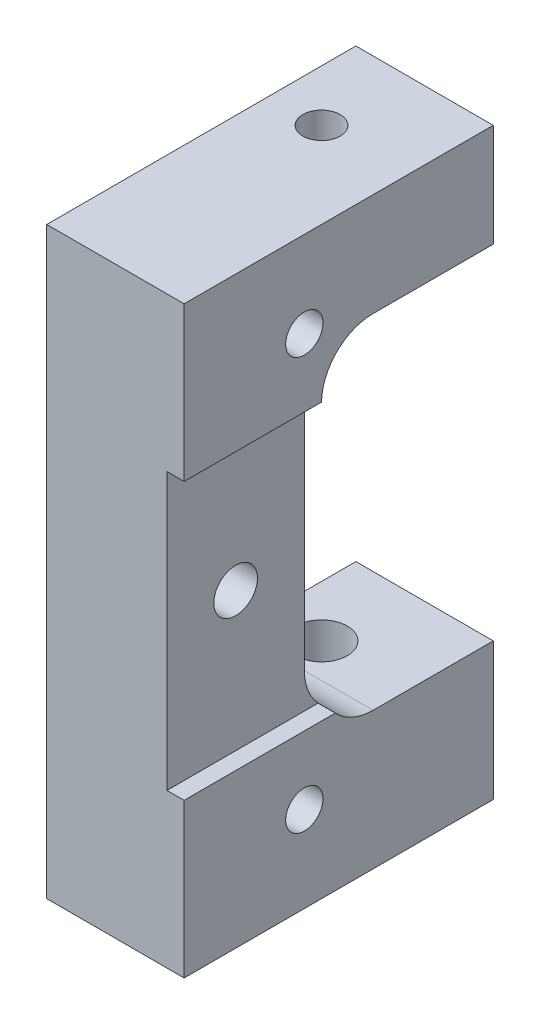
ISO-10303-21;
HEADER;
FILE_DESCRIPTION(('STEP AP214'),'2;1');
FILE_NAME('part.step','',(''),(''),'','','');
FILE_SCHEMA(('AUTOMOTIVE_DESIGN { 1 0 10303 214 1 1 1 1 }'));
ENDSEC;
DATA;
#1=APPLICATION_CONTEXT('core data for automotive mechanical design processes');
#2=APPLICATION_PROTOCOL_DEFINITION('international standard','automotive_design',2000,#1);
#3=PRODUCT_CONTEXT('',#1,'mechanical');
#4=PRODUCT('Part','Part','',(#3));
#5=PRODUCT_RELATED_PRODUCT_CATEGORY('part','',(#4));
#6=PRODUCT_DEFINITION_FORMATION('','',#4);
#7=PRODUCT_DEFINITION_CONTEXT('part definition',#1,'design');
#8=PRODUCT_DEFINITION('design','',#6,#7);
#9=PRODUCT_DEFINITION_SHAPE('','',#8);
#10=(LENGTH_UNIT() NAMED_UNIT(*) SI_UNIT(.MILLI.,.METRE.));
#11=(NAMED_UNIT(*) PLANE_ANGLE_UNIT() SI_UNIT($,.RADIAN.));
#12=(NAMED_UNIT(*) SI_UNIT($,.STERADIAN.) SOLID_ANGLE_UNIT());
#13=UNCERTAINTY_MEASURE_WITH_UNIT(LENGTH_MEASURE(1.E-05),#10,'distance_accuracy_value','');
#14=(GEOMETRIC_REPRESENTATION_CONTEXT(3) GLOBAL_UNCERTAINTY_ASSIGNED_CONTEXT((#13)) GLOBAL_UNIT_ASSIGNED_CONTEXT((#10,
#11,#12)) REPRESENTATION_CONTEXT('',''));
#15=CARTESIAN_POINT('',(0.,0.,0.));
#16=DIRECTION('',(0.,0.,1.));
#17=DIRECTION('',(1.,0.,0.));
#18=AXIS2_PLACEMENT_3D('',#15,#16,#17);
#19=CARTESIAN_POINT('',(-6.35,-46.0375,3.175));
#20=DIRECTION('',(1.,0.,0.));
#21=DIRECTION('',(0.,0.,-1.));
#22=AXIS2_PLACEMENT_3D('',#19,#20,#21);
#23=CYLINDRICAL_SURFACE('',#22,1.7272);
#24=CARTESIAN_POINT('',(6.35,-46.0375,3.175));
#25=DIRECTION('',(1.,0.,0.));
#26=DIRECTION('',(0.,0.,-1.));
#27=AXIS2_PLACEMENT_3D('',#24,#25,#26);
#28=CIRCLE('',#27,1.7272);
#29=CARTESIAN_POINT('',(6.35,-46.0375,1.4478));
#30=VERTEX_POINT('',#29);
#31=EDGE_CURVE('E129',#30,#30,#28,.F.);
#32=ORIENTED_EDGE('',*,*,#31,.F.);
#33=EDGE_LOOP('',(#32));
#34=FACE_BOUND('',#33,.T.);
#35=CARTESIAN_POINT('',(-5.08,-46.0375,3.175));
#36=DIRECTION('',(-1.,0.,0.));
#37=DIRECTION('',(0.,0.,1.));
#38=AXIS2_PLACEMENT_3D('',#35,#36,#37);
#39=CIRCLE('',#38,1.7272);
#40=CARTESIAN_POINT('',(-5.08,-46.0375,4.9022));
#41=VERTEX_POINT('',#40);
#42=EDGE_CURVE('E21',#41,#41,#39,.T.);
#43=ORIENTED_EDGE('',*,*,#42,.T.);
#44=EDGE_LOOP('',(#43));
#45=FACE_BOUND('',#44,.T.);
#46=ADVANCED_FACE('F17',(#34,#45),#23,.F.);
#47=CARTESIAN_POINT('',(-6.35,-7.9375,3.175));
#48=DIRECTION('',(1.,0.,0.));
#49=DIRECTION('',(0.,0.,-1.));
#50=AXIS2_PLACEMENT_3D('',#47,#48,#49);
#51=CYLINDRICAL_SURFACE('',#50,1.7272);
#52=CARTESIAN_POINT('',(6.35,-7.9375,3.175));
#53=DIRECTION('',(1.,0.,0.));
#54=DIRECTION('',(0.,0.,-1.));
#55=AXIS2_PLACEMENT_3D('',#52,#53,#54);
#56=CIRCLE('',#55,1.7272);
#57=CARTESIAN_POINT('',(6.35,-7.9375,1.4478));
#58=VERTEX_POINT('',#57);
#59=EDGE_CURVE('E239',#58,#58,#56,.F.);
#60=ORIENTED_EDGE('',*,*,#59,.F.);
#61=EDGE_LOOP('',(#60));
#62=FACE_BOUND('',#61,.T.);
#63=CARTESIAN_POINT('',(-5.08,-7.9375,3.175));
#64=DIRECTION('',(-1.,0.,0.));
#65=DIRECTION('',(0.,0.,1.));
#66=AXIS2_PLACEMENT_3D('',#63,#64,#65);
#67=CIRCLE('',#66,1.7272);
#68=CARTESIAN_POINT('',(-5.08,-7.9375,4.9022));
#69=VERTEX_POINT('',#68);
#70=EDGE_CURVE('E189',#69,#69,#67,.T.);
#71=ORIENTED_EDGE('',*,*,#70,.T.);
#72=EDGE_LOOP('',(#71));
#73=FACE_BOUND('',#72,.T.);
#74=ADVANCED_FACE('F312',(#62,#73),#51,.F.);
#75=CARTESIAN_POINT('',(0.,-53.975,-14.2875));
#76=DIRECTION('',(0.,0.,-1.));
#77=DIRECTION('',(-1.,0.,0.));
#78=AXIS2_PLACEMENT_3D('',#75,#76,#77);
#79=PLANE('',#78);
#80=DIRECTION('',(0.,1.,0.));
#81=VECTOR('',#80,1.);
#82=CARTESIAN_POINT('',(6.35,-53.975,-14.2875));
#83=LINE('',#82,#81);
#84=CARTESIAN_POINT('',(6.35,-9.5188278,-14.2875));
#85=VERTEX_POINT('',#84);
#86=CARTESIAN_POINT('',(6.35,0.,-14.2875));
#87=VERTEX_POINT('',#86);
#88=EDGE_CURVE('E266',#85,#87,#83,.T.);
#89=ORIENTED_EDGE('',*,*,#88,.F.);
#90=DIRECTION('',(-1.,0.,0.));
#91=VECTOR('',#90,1.);
#92=CARTESIAN_POINT('',(56.0388525864335,-9.5188278,-14.2875));
#93=LINE('',#92,#91);
#94=CARTESIAN_POINT('',(-6.35,-9.5188278,-14.2875));
#95=VERTEX_POINT('',#94);
#96=EDGE_CURVE('E130',#85,#95,#93,.T.);
#97=ORIENTED_EDGE('',*,*,#96,.T.);
#98=DIRECTION('',(0.,1.,0.));
#99=VECTOR('',#98,1.);
#100=CARTESIAN_POINT('',(-6.35,-53.975,-14.2875));
#101=LINE('',#100,#99);
#102=CARTESIAN_POINT('',(-6.35,0.,-14.2875));
#103=VERTEX_POINT('',#102);
#104=EDGE_CURVE('E147',#95,#103,#101,.T.);
#105=ORIENTED_EDGE('',*,*,#104,.T.);
#106=DIRECTION('',(-1.,0.,0.));
#107=VECTOR('',#106,1.);
#108=CARTESIAN_POINT('',(0.,0.,-14.2875));
#109=LINE('',#108,#107);
#110=EDGE_CURVE('E261',#87,#103,#109,.T.);
#111=ORIENTED_EDGE('',*,*,#110,.F.);
#112=EDGE_LOOP('',(#89,#97,#105,#111));
#113=FACE_BOUND('',#112,.T.);
#114=ADVANCED_FACE('F282',(#113),#79,.T.);
#115=CARTESIAN_POINT('',(6.35,-53.975,0.));
#116=DIRECTION('',(1.,0.,0.));
#117=DIRECTION('',(0.,0.,-1.));
#118=AXIS2_PLACEMENT_3D('',#115,#116,#117);
#119=PLANE('',#118);
#120=ORIENTED_EDGE('',*,*,#59,.T.);
#121=EDGE_LOOP('',(#120));
#122=FACE_BOUND('',#121,.T.);
#123=DIRECTION('',(0.,0.,-1.));
#124=VECTOR('',#123,1.);
#125=CARTESIAN_POINT('',(6.35,-14.224,0.));
#126=LINE('',#125,#124);
#127=CARTESIAN_POINT('',(6.35,-14.224,14.2875));
#128=VERTEX_POINT('',#127);
#129=CARTESIAN_POINT('',(6.35,-14.224,1.58715495058143));
#130=VERTEX_POINT('',#129);
#131=EDGE_CURVE('E33',#128,#130,#126,.T.);
#132=ORIENTED_EDGE('',*,*,#131,.T.);
#133=CARTESIAN_POINT('',(6.35,-14.2813278,-3.175));
#134=DIRECTION('',(1.,0.,0.));
#135=DIRECTION('',(0.,0.,-1.));
#136=AXIS2_PLACEMENT_3D('',#133,#134,#135);
#137=CIRCLE('',#136,4.7625);
#138=CARTESIAN_POINT('',(6.35,-9.5188278,-3.175));
#139=VERTEX_POINT('',#138);
#140=EDGE_CURVE('E11',#130,#139,#137,.F.);
#141=ORIENTED_EDGE('',*,*,#140,.T.);
#142=DIRECTION('',(0.,0.,1.));
#143=VECTOR('',#142,1.);
#144=CARTESIAN_POINT('',(6.35,-9.5188278,0.));
#145=LINE('',#144,#143);
#146=EDGE_CURVE('E163',#85,#139,#145,.T.);
#147=ORIENTED_EDGE('',*,*,#146,.F.);
#148=ORIENTED_EDGE('',*,*,#88,.T.);
#149=DIRECTION('',(0.,0.,-1.));
#150=VECTOR('',#149,1.);
#151=CARTESIAN_POINT('',(6.35,0.,0.));
#152=LINE('',#151,#150);
#153=CARTESIAN_POINT('',(6.35,0.,14.2875));
#154=VERTEX_POINT('',#153);
#155=EDGE_CURVE('E256',#154,#87,#152,.T.);
#156=ORIENTED_EDGE('',*,*,#155,.F.);
#157=DIRECTION('',(0.,1.,0.));
#158=VECTOR('',#157,1.);
#159=CARTESIAN_POINT('',(6.35,-53.975,14.2875));
#160=LINE('',#159,#158);
#161=EDGE_CURVE('E150',#128,#154,#160,.T.);
#162=ORIENTED_EDGE('',*,*,#161,.F.);
#163=EDGE_LOOP('',(#132,#141,#147,#148,#156,#162));
#164=FACE_BOUND('',#163,.T.);
#165=ADVANCED_FACE('F290',(#122,#164),#119,.T.);
#166=CARTESIAN_POINT('',(-6.35,-53.975,0.));
#167=DIRECTION('',(1.,0.,0.));
#168=DIRECTION('',(0.,0.,-1.));
#169=AXIS2_PLACEMENT_3D('',#166,#167,#168);
#170=PLANE('',#169);
#171=CARTESIAN_POINT('',(-6.35,-7.9375,3.175));
#172=DIRECTION('',(-1.,0.,0.));
#173=DIRECTION('',(0.,0.,1.));
#174=AXIS2_PLACEMENT_3D('',#171,#172,#173);
#175=CIRCLE('',#174,3.96875);
#176=CARTESIAN_POINT('',(-6.35,-7.9375,7.14375));
#177=VERTEX_POINT('',#176);
#178=EDGE_CURVE('E197',#177,#177,#175,.T.);
#179=ORIENTED_EDGE('',*,*,#178,.F.);
#180=EDGE_LOOP('',(#179));
#181=FACE_BOUND('',#180,.T.);
#182=CARTESIAN_POINT('',(-6.35,-46.0375,3.175));
#183=DIRECTION('',(-1.,0.,0.));
#184=DIRECTION('',(0.,0.,1.));
#185=AXIS2_PLACEMENT_3D('',#182,#183,#184);
#186=CIRCLE('',#185,3.96875);
#187=CARTESIAN_POINT('',(-6.35,-46.0375,7.14375));
#188=VERTEX_POINT('',#187);
#189=EDGE_CURVE('E207',#188,#188,#186,.T.);
#190=ORIENTED_EDGE('',*,*,#189,.F.);
#191=EDGE_LOOP('',(#190));
#192=FACE_BOUND('',#191,.T.);
#193=CARTESIAN_POINT('',(-6.35,-26.924,7.9375));
#194=DIRECTION('',(1.,0.,0.));
#195=DIRECTION('',(0.,0.,-1.));
#196=AXIS2_PLACEMENT_3D('',#193,#194,#195);
#197=CIRCLE('',#196,4.7625);
#198=CARTESIAN_POINT('',(-6.35,-26.924,3.175));
#199=VERTEX_POINT('',#198);
#200=EDGE_CURVE('E218',#199,#199,#197,.T.);
#201=ORIENTED_EDGE('',*,*,#200,.T.);
#202=EDGE_LOOP('',(#201));
#203=FACE_BOUND('',#202,.T.);
#204=DIRECTION('',(0.,0.,1.));
#205=VECTOR('',#204,1.);
#206=CARTESIAN_POINT('',(-6.35,-41.275,-6.35));
#207=LINE('',#206,#205);
#208=CARTESIAN_POINT('',(-6.35,-41.275,-14.2875));
#209=VERTEX_POINT('',#208);
#210=CARTESIAN_POINT('',(-6.35,-41.275,-3.175));
#211=VERTEX_POINT('',#210);
#212=EDGE_CURVE('E122',#209,#211,#207,.T.);
#213=ORIENTED_EDGE('',*,*,#212,.F.);
#214=CARTESIAN_POINT('',(-6.35,-53.975,-14.2875));
#215=VERTEX_POINT('',#214);
#216=EDGE_CURVE('E136',#215,#209,#101,.T.);
#217=ORIENTED_EDGE('',*,*,#216,.F.);
#218=DIRECTION('',(0.,0.,-1.));
#219=VECTOR('',#218,1.);
#220=CARTESIAN_POINT('',(-6.35,-53.975,0.));
#221=LINE('',#220,#219);
#222=CARTESIAN_POINT('',(-6.35,-53.975,14.2875));
#223=VERTEX_POINT('',#222);
#224=EDGE_CURVE('E263',#223,#215,#221,.T.);
#225=ORIENTED_EDGE('',*,*,#224,.F.);
#226=DIRECTION('',(0.,1.,0.));
#227=VECTOR('',#226,1.);
#228=CARTESIAN_POINT('',(-6.35,-53.975,14.2875));
#229=LINE('',#228,#227);
#230=CARTESIAN_POINT('',(-6.35,0.,14.2875));
#231=VERTEX_POINT('',#230);
#232=EDGE_CURVE('E146',#223,#231,#229,.T.);
#233=ORIENTED_EDGE('',*,*,#232,.T.);
#234=DIRECTION('',(0.,0.,-1.));
#235=VECTOR('',#234,1.);
#236=CARTESIAN_POINT('',(-6.35,0.,0.));
#237=LINE('',#236,#235);
#238=EDGE_CURVE('E271',#231,#103,#237,.T.);
#239=ORIENTED_EDGE('',*,*,#238,.T.);
#240=ORIENTED_EDGE('',*,*,#104,.F.);
#241=DIRECTION('',(0.,0.,-1.));
#242=VECTOR('',#241,1.);
#243=CARTESIAN_POINT('',(-6.35,-9.5188278,-6.35));
#244=LINE('',#243,#242);
#245=CARTESIAN_POINT('',(-6.35,-9.5188278,-3.175));
#246=VERTEX_POINT('',#245);
#247=EDGE_CURVE('E233',#246,#95,#244,.T.);
#248=ORIENTED_EDGE('',*,*,#247,.F.);
#249=CARTESIAN_POINT('',(-6.35,-14.2813278,-3.175));
#250=DIRECTION('',(1.,0.,0.));
#251=DIRECTION('',(0.,0.,-1.));
#252=AXIS2_PLACEMENT_3D('',#249,#250,#251);
#253=CIRCLE('',#252,4.7625);
#254=CARTESIAN_POINT('',(-6.35,-14.2813278,1.5875));
#255=VERTEX_POINT('',#254);
#256=EDGE_CURVE('E185',#246,#255,#253,.T.);
#257=ORIENTED_EDGE('',*,*,#256,.T.);
#258=DIRECTION('',(0.,-1.,0.));
#259=VECTOR('',#258,1.);
#260=CARTESIAN_POINT('',(-6.35,-26.9875,1.5875));
#261=LINE('',#260,#259);
#262=CARTESIAN_POINT('',(-6.35,-36.5125,1.5875));
#263=VERTEX_POINT('',#262);
#264=EDGE_CURVE('E140',#255,#263,#261,.T.);
#265=ORIENTED_EDGE('',*,*,#264,.T.);
#266=CARTESIAN_POINT('',(-6.35,-36.5125,-3.175));
#267=DIRECTION('',(1.,0.,0.));
#268=DIRECTION('',(0.,0.,-1.));
#269=AXIS2_PLACEMENT_3D('',#266,#267,#268);
#270=CIRCLE('',#269,4.7625);
#271=EDGE_CURVE('E139',#263,#211,#270,.T.);
#272=ORIENTED_EDGE('',*,*,#271,.T.);
#273=EDGE_LOOP('',(#213,#217,#225,#233,#239,#240,#248,#257,#265,#272));
#274=FACE_BOUND('',#273,.T.);
#275=ADVANCED_FACE('F134',(#181,#192,#203,#274),#170,.F.);
#276=CARTESIAN_POINT('',(4.7625,-39.751,0.));
#277=DIRECTION('',(0.,-1.,0.));
#278=DIRECTION('',(0.,0.,-1.));
#279=AXIS2_PLACEMENT_3D('',#276,#277,#278);
#280=PLANE('',#279);
#281=DIRECTION('',(0.,0.,-1.));
#282=VECTOR('',#281,1.);
#283=CARTESIAN_POINT('',(6.35,-39.751,0.));
#284=LINE('',#283,#282);
#285=CARTESIAN_POINT('',(6.35,-39.751,14.2875));
#286=VERTEX_POINT('',#285);
#287=CARTESIAN_POINT('',(6.35,-39.751,0.316922679556357));
#288=VERTEX_POINT('',#287);
#289=EDGE_CURVE('E242',#286,#288,#284,.T.);
#290=ORIENTED_EDGE('',*,*,#289,.T.);
#291=DIRECTION('',(-1.,0.,0.));
#292=VECTOR('',#291,1.);
#293=CARTESIAN_POINT('',(6.35,-39.751,0.316922679556357));
#294=LINE('',#293,#292);
#295=CARTESIAN_POINT('',(4.7625,-39.751,0.316922679556357));
#296=VERTEX_POINT('',#295);
#297=EDGE_CURVE('E180',#288,#296,#294,.T.);
#298=ORIENTED_EDGE('',*,*,#297,.T.);
#299=DIRECTION('',(0.,0.,-1.));
#300=VECTOR('',#299,1.);
#301=CARTESIAN_POINT('',(4.7625,-39.751,0.));
#302=LINE('',#301,#300);
#303=CARTESIAN_POINT('',(4.7625,-39.751,14.2875));
#304=VERTEX_POINT('',#303);
#305=EDGE_CURVE('E246',#304,#296,#302,.T.);
#306=ORIENTED_EDGE('',*,*,#305,.F.);
#307=DIRECTION('',(1.,0.,0.));
#308=VECTOR('',#307,1.);
#309=CARTESIAN_POINT('',(4.7625,-39.751,14.2875));
#310=LINE('',#309,#308);
#311=EDGE_CURVE('E254',#304,#286,#310,.T.);
#312=ORIENTED_EDGE('',*,*,#311,.T.);
#313=EDGE_LOOP('',(#290,#298,#306,#312));
#314=FACE_BOUND('',#313,.T.);
#315=ADVANCED_FACE('F330',(#314),#280,.F.);
#316=CARTESIAN_POINT('',(4.7625,-14.224,0.));
#317=DIRECTION('',(0.,-1.,0.));
#318=DIRECTION('',(0.,0.,-1.));
#319=AXIS2_PLACEMENT_3D('',#316,#317,#318);
#320=PLANE('',#319);
#321=DIRECTION('',(0.,0.,-1.));
#322=VECTOR('',#321,1.);
#323=CARTESIAN_POINT('',(4.7625,-14.224,0.));
#324=LINE('',#323,#322);
#325=CARTESIAN_POINT('',(4.7625,-14.224,14.2875));
#326=VERTEX_POINT('',#325);
#327=CARTESIAN_POINT('',(4.7625,-14.224,1.58715495058143));
#328=VERTEX_POINT('',#327);
#329=EDGE_CURVE('E40',#326,#328,#324,.T.);
#330=ORIENTED_EDGE('',*,*,#329,.T.);
#331=DIRECTION('',(-1.,0.,0.));
#332=VECTOR('',#331,1.);
#333=CARTESIAN_POINT('',(4.7625,-14.224,1.58715495058143));
#334=LINE('',#333,#332);
#335=EDGE_CURVE('E26',#328,#130,#334,.F.);
#336=ORIENTED_EDGE('',*,*,#335,.T.);
#337=ORIENTED_EDGE('',*,*,#131,.F.);
#338=DIRECTION('',(1.,0.,0.));
#339=VECTOR('',#338,1.);
#340=CARTESIAN_POINT('',(4.7625,-14.224,14.2875));
#341=LINE('',#340,#339);
#342=EDGE_CURVE('E249',#326,#128,#341,.T.);
#343=ORIENTED_EDGE('',*,*,#342,.F.);
#344=EDGE_LOOP('',(#330,#336,#337,#343));
#345=FACE_BOUND('',#344,.T.);
#346=ADVANCED_FACE('F327',(#345),#320,.T.);
#347=CARTESIAN_POINT('',(4.7625,-26.9875,0.));
#348=DIRECTION('',(1.,0.,0.));
#349=DIRECTION('',(0.,1.,0.));
#350=AXIS2_PLACEMENT_3D('',#347,#348,#349);
#351=PLANE('',#350);
#352=CARTESIAN_POINT('',(4.7625,-26.924,7.9375));
#353=DIRECTION('',(1.,0.,0.));
#354=DIRECTION('',(0.,0.,-1.));
#355=AXIS2_PLACEMENT_3D('',#352,#353,#354);
#356=CIRCLE('',#355,2.0193);
#357=CARTESIAN_POINT('',(4.7625,-26.924,5.9182));
#358=VERTEX_POINT('',#357);
#359=EDGE_CURVE('E195',#358,#358,#356,.T.);
#360=ORIENTED_EDGE('',*,*,#359,.F.);
#361=EDGE_LOOP('',(#360));
#362=FACE_BOUND('',#361,.T.);
#363=ORIENTED_EDGE('',*,*,#305,.T.);
#364=CARTESIAN_POINT('',(4.7625,-36.5125,-3.175));
#365=DIRECTION('',(1.,0.,0.));
#366=DIRECTION('',(0.,0.,-1.));
#367=AXIS2_PLACEMENT_3D('',#364,#365,#366);
#368=CIRCLE('',#367,4.7625);
#369=CARTESIAN_POINT('',(4.7625,-36.5125,1.5875));
#370=VERTEX_POINT('',#369);
#371=EDGE_CURVE('E183',#296,#370,#368,.F.);
#372=ORIENTED_EDGE('',*,*,#371,.T.);
#373=DIRECTION('',(0.,1.,0.));
#374=VECTOR('',#373,1.);
#375=CARTESIAN_POINT('',(4.7625,-26.9875,1.5875));
#376=LINE('',#375,#374);
#377=CARTESIAN_POINT('',(4.7625,-14.2813278,1.5875));
#378=VERTEX_POINT('',#377);
#379=EDGE_CURVE('E159',#370,#378,#376,.T.);
#380=ORIENTED_EDGE('',*,*,#379,.T.);
#381=CARTESIAN_POINT('',(4.7625,-14.2813278,-3.175));
#382=DIRECTION('',(1.,0.,0.));
#383=DIRECTION('',(0.,0.,-1.));
#384=AXIS2_PLACEMENT_3D('',#381,#382,#383);
#385=CIRCLE('',#384,4.7625);
#386=EDGE_CURVE('E187',#378,#328,#385,.F.);
#387=ORIENTED_EDGE('',*,*,#386,.T.);
#388=ORIENTED_EDGE('',*,*,#329,.F.);
#389=DIRECTION('',(0.,1.,0.));
#390=VECTOR('',#389,1.);
#391=CARTESIAN_POINT('',(4.7625,-53.975,14.2875));
#392=LINE('',#391,#390);
#393=EDGE_CURVE('E243',#304,#326,#392,.T.);
#394=ORIENTED_EDGE('',*,*,#393,.F.);
#395=EDGE_LOOP('',(#363,#372,#380,#387,#388,#394));
#396=FACE_BOUND('',#395,.T.);
#397=ADVANCED_FACE('F324',(#362,#396),#351,.T.);
#398=DIRECTION('',(-1.,0.,0.));
#399=VECTOR('',#398,1.);
#400=CARTESIAN_POINT('',(56.0388525864335,-41.275,-14.2875));
#401=LINE('',#400,#399);
#402=CARTESIAN_POINT('',(6.35,-41.275,-14.2875));
#403=VERTEX_POINT('',#402);
#404=EDGE_CURVE('E119',#403,#209,#401,.T.);
#405=ORIENTED_EDGE('',*,*,#404,.F.);
#406=CARTESIAN_POINT('',(6.35,-53.975,-14.2875));
#407=VERTEX_POINT('',#406);
#408=EDGE_CURVE('E152',#407,#403,#83,.T.);
#409=ORIENTED_EDGE('',*,*,#408,.F.);
#410=DIRECTION('',(-1.,0.,0.));
#411=VECTOR('',#410,1.);
#412=CARTESIAN_POINT('',(0.,-53.975,-14.2875));
#413=LINE('',#412,#411);
#414=EDGE_CURVE('E145',#407,#215,#413,.T.);
#415=ORIENTED_EDGE('',*,*,#414,.T.);
#416=ORIENTED_EDGE('',*,*,#216,.T.);
#417=EDGE_LOOP('',(#405,#409,#415,#416));
#418=FACE_BOUND('',#417,.T.);
#419=ADVANCED_FACE('F143',(#418),#79,.T.);
#420=DIRECTION('',(0.,0.,-1.));
#421=VECTOR('',#420,1.);
#422=CARTESIAN_POINT('',(6.35,-41.275,0.));
#423=LINE('',#422,#421);
#424=CARTESIAN_POINT('',(6.35,-41.275,-3.175));
#425=VERTEX_POINT('',#424);
#426=EDGE_CURVE('E125',#425,#403,#423,.T.);
#427=ORIENTED_EDGE('',*,*,#426,.F.);
#428=CARTESIAN_POINT('',(6.35,-36.5125,-3.175));
#429=DIRECTION('',(1.,0.,0.));
#430=DIRECTION('',(0.,0.,-1.));
#431=AXIS2_PLACEMENT_3D('',#428,#429,#430);
#432=CIRCLE('',#431,4.7625);
#433=EDGE_CURVE('E177',#425,#288,#432,.F.);
#434=ORIENTED_EDGE('',*,*,#433,.T.);
#435=ORIENTED_EDGE('',*,*,#289,.F.);
#436=CARTESIAN_POINT('',(6.35,-53.975,14.2875));
#437=VERTEX_POINT('',#436);
#438=EDGE_CURVE('E156',#437,#286,#160,.T.);
#439=ORIENTED_EDGE('',*,*,#438,.F.);
#440=DIRECTION('',(0.,0.,-1.));
#441=VECTOR('',#440,1.);
#442=CARTESIAN_POINT('',(6.35,-53.975,0.));
#443=LINE('',#442,#441);
#444=EDGE_CURVE('E257',#437,#407,#443,.T.);
#445=ORIENTED_EDGE('',*,*,#444,.T.);
#446=ORIENTED_EDGE('',*,*,#408,.T.);
#447=EDGE_LOOP('',(#427,#434,#435,#439,#445,#446));
#448=FACE_BOUND('',#447,.T.);
#449=ORIENTED_EDGE('',*,*,#31,.T.);
#450=EDGE_LOOP('',(#449));
#451=FACE_BOUND('',#450,.T.);
#452=ADVANCED_FACE('F293',(#448,#451),#119,.T.);
#453=CARTESIAN_POINT('',(0.,-53.975,14.2875));
#454=DIRECTION('',(0.,0.,-1.));
#455=DIRECTION('',(-1.,0.,0.));
#456=AXIS2_PLACEMENT_3D('',#453,#454,#455);
#457=PLANE('',#456);
#458=ORIENTED_EDGE('',*,*,#393,.T.);
#459=ORIENTED_EDGE('',*,*,#342,.T.);
#460=ORIENTED_EDGE('',*,*,#161,.T.);
#461=DIRECTION('',(-1.,0.,0.));
#462=VECTOR('',#461,1.);
#463=CARTESIAN_POINT('',(0.,0.,14.2875));
#464=LINE('',#463,#462);
#465=EDGE_CURVE('E269',#154,#231,#464,.T.);
#466=ORIENTED_EDGE('',*,*,#465,.T.);
#467=ORIENTED_EDGE('',*,*,#232,.F.);
#468=DIRECTION('',(-1.,0.,0.));
#469=VECTOR('',#468,1.);
#470=CARTESIAN_POINT('',(0.,-53.975,14.2875));
#471=LINE('',#470,#469);
#472=EDGE_CURVE('E260',#437,#223,#471,.T.);
#473=ORIENTED_EDGE('',*,*,#472,.F.);
#474=ORIENTED_EDGE('',*,*,#438,.T.);
#475=ORIENTED_EDGE('',*,*,#311,.F.);
#476=EDGE_LOOP('',(#458,#459,#460,#466,#467,#473,#474,#475));
#477=FACE_BOUND('',#476,.T.);
#478=ADVANCED_FACE('F288',(#477),#457,.F.);
#479=CARTESIAN_POINT('',(0.,-53.975,0.));
#480=DIRECTION('',(0.,-1.,0.));
#481=DIRECTION('',(1.,0.,0.));
#482=AXIS2_PLACEMENT_3D('',#479,#480,#481);
#483=PLANE('',#482);
#484=CARTESIAN_POINT('',(-1.5875,-53.975,-6.35));
#485=DIRECTION('',(0.,1.,0.));
#486=DIRECTION('',(0.,0.,1.));
#487=AXIS2_PLACEMENT_3D('',#484,#485,#486);
#488=CIRCLE('',#487,2.38125);
#489=CARTESIAN_POINT('',(-1.5875,-53.975,-3.96875));
#490=VERTEX_POINT('',#489);
#491=EDGE_CURVE('E141',#490,#490,#488,.T.);
#492=ORIENTED_EDGE('',*,*,#491,.T.);
#493=EDGE_LOOP('',(#492));
#494=FACE_BOUND('',#493,.T.);
#495=ORIENTED_EDGE('',*,*,#444,.F.);
#496=ORIENTED_EDGE('',*,*,#472,.T.);
#497=ORIENTED_EDGE('',*,*,#224,.T.);
#498=ORIENTED_EDGE('',*,*,#414,.F.);
#499=EDGE_LOOP('',(#495,#496,#497,#498));
#500=FACE_BOUND('',#499,.T.);
#501=ADVANCED_FACE('F298',(#494,#500),#483,.T.);
#502=CARTESIAN_POINT('',(0.,0.,0.));
#503=DIRECTION('',(0.,-1.,0.));
#504=DIRECTION('',(1.,0.,0.));
#505=AXIS2_PLACEMENT_3D('',#502,#503,#504);
#506=PLANE('',#505);
#507=CARTESIAN_POINT('',(-1.5875,0.,-6.35));
#508=DIRECTION('',(0.,1.,0.));
#509=DIRECTION('',(0.,0.,1.));
#510=AXIS2_PLACEMENT_3D('',#507,#508,#509);
#511=CIRCLE('',#510,1.7272);
#512=CARTESIAN_POINT('',(-1.5875,0.,-4.6228));
#513=VERTEX_POINT('',#512);
#514=EDGE_CURVE('E221',#513,#513,#511,.T.);
#515=ORIENTED_EDGE('',*,*,#514,.F.);
#516=EDGE_LOOP('',(#515));
#517=FACE_BOUND('',#516,.T.);
#518=ORIENTED_EDGE('',*,*,#155,.T.);
#519=ORIENTED_EDGE('',*,*,#110,.T.);
#520=ORIENTED_EDGE('',*,*,#238,.F.);
#521=ORIENTED_EDGE('',*,*,#465,.F.);
#522=EDGE_LOOP('',(#518,#519,#520,#521));
#523=FACE_BOUND('',#522,.T.);
#524=ADVANCED_FACE('F277',(#517,#523),#506,.F.);
#525=CARTESIAN_POINT('',(56.0388525864335,-41.275,-6.35));
#526=DIRECTION('',(0.,-1.,0.));
#527=DIRECTION('',(0.,0.,-1.));
#528=AXIS2_PLACEMENT_3D('',#525,#526,#527);
#529=PLANE('',#528);
#530=CARTESIAN_POINT('',(-1.5875,-41.275,-6.35));
#531=DIRECTION('',(0.,1.,0.));
#532=DIRECTION('',(0.,0.,1.));
#533=AXIS2_PLACEMENT_3D('',#530,#531,#532);
#534=CIRCLE('',#533,2.38125);
#535=CARTESIAN_POINT('',(-1.5875,-41.275,-3.96875));
#536=VERTEX_POINT('',#535);
#537=EDGE_CURVE('E227',#536,#536,#534,.T.);
#538=ORIENTED_EDGE('',*,*,#537,.F.);
#539=EDGE_LOOP('',(#538));
#540=FACE_BOUND('',#539,.T.);
#541=ORIENTED_EDGE('',*,*,#212,.T.);
#542=DIRECTION('',(-1.,0.,0.));
#543=VECTOR('',#542,1.);
#544=CARTESIAN_POINT('',(56.0388525864335,-41.275,-3.175));
#545=LINE('',#544,#543);
#546=EDGE_CURVE('E171',#211,#425,#545,.F.);
#547=ORIENTED_EDGE('',*,*,#546,.T.);
#548=ORIENTED_EDGE('',*,*,#426,.T.);
#549=ORIENTED_EDGE('',*,*,#404,.T.);
#550=EDGE_LOOP('',(#541,#547,#548,#549));
#551=FACE_BOUND('',#550,.T.);
#552=ADVANCED_FACE('F121',(#540,#551),#529,.F.);
#553=CARTESIAN_POINT('',(56.0388525864335,-26.9875,1.5875));
#554=DIRECTION('',(0.,0.,-1.));
#555=DIRECTION('',(-1.,0.,0.));
#556=AXIS2_PLACEMENT_3D('',#553,#554,#555);
#557=PLANE('',#556);
#558=ORIENTED_EDGE('',*,*,#379,.F.);
#559=DIRECTION('',(-1.,0.,0.));
#560=VECTOR('',#559,1.);
#561=CARTESIAN_POINT('',(56.0388525864335,-36.5125,1.5875));
#562=LINE('',#561,#560);
#563=EDGE_CURVE('E168',#370,#263,#562,.T.);
#564=ORIENTED_EDGE('',*,*,#563,.T.);
#565=ORIENTED_EDGE('',*,*,#264,.F.);
#566=DIRECTION('',(-1.,0.,0.));
#567=VECTOR('',#566,1.);
#568=CARTESIAN_POINT('',(56.0388525864335,-14.2813278,1.5875));
#569=LINE('',#568,#567);
#570=EDGE_CURVE('E166',#255,#378,#569,.F.);
#571=ORIENTED_EDGE('',*,*,#570,.T.);
#572=EDGE_LOOP('',(#558,#564,#565,#571));
#573=FACE_BOUND('',#572,.T.);
#574=ADVANCED_FACE('F349',(#573),#557,.T.);
#575=CARTESIAN_POINT('',(56.0388525864335,-9.5188278,-6.35));
#576=DIRECTION('',(0.,1.,0.));
#577=DIRECTION('',(0.,0.,1.));
#578=AXIS2_PLACEMENT_3D('',#575,#576,#577);
#579=PLANE('',#578);
#580=CARTESIAN_POINT('',(-1.5875,-9.5188278,-6.35));
#581=DIRECTION('',(0.,1.,0.));
#582=DIRECTION('',(0.,0.,1.));
#583=AXIS2_PLACEMENT_3D('',#580,#581,#582);
#584=CIRCLE('',#583,1.7272);
#585=CARTESIAN_POINT('',(-1.5875,-9.5188278,-4.6228));
#586=VERTEX_POINT('',#585);
#587=EDGE_CURVE('E224',#586,#586,#584,.T.);
#588=ORIENTED_EDGE('',*,*,#587,.T.);
#589=EDGE_LOOP('',(#588));
#590=FACE_BOUND('',#589,.T.);
#591=ORIENTED_EDGE('',*,*,#146,.T.);
#592=DIRECTION('',(-1.,0.,0.));
#593=VECTOR('',#592,1.);
#594=CARTESIAN_POINT('',(56.0388525864335,-9.5188278,-3.175));
#595=LINE('',#594,#593);
#596=EDGE_CURVE('E173',#139,#246,#595,.T.);
#597=ORIENTED_EDGE('',*,*,#596,.T.);
#598=ORIENTED_EDGE('',*,*,#247,.T.);
#599=ORIENTED_EDGE('',*,*,#96,.F.);
#600=EDGE_LOOP('',(#591,#597,#598,#599));
#601=FACE_BOUND('',#600,.T.);
#602=ADVANCED_FACE('F357',(#590,#601),#579,.F.);
#603=CARTESIAN_POINT('',(-1.5875,-53.975,-6.35));
#604=DIRECTION('',(0.,1.,0.));
#605=DIRECTION('',(0.,0.,1.));
#606=AXIS2_PLACEMENT_3D('',#603,#604,#605);
#607=CYLINDRICAL_SURFACE('',#606,2.38125);
#608=ORIENTED_EDGE('',*,*,#537,.T.);
#609=EDGE_LOOP('',(#608));
#610=FACE_BOUND('',#609,.T.);
#611=ORIENTED_EDGE('',*,*,#491,.F.);
#612=EDGE_LOOP('',(#611));
#613=FACE_BOUND('',#612,.T.);
#614=ADVANCED_FACE('F359',(#610,#613),#607,.F.);
#615=CARTESIAN_POINT('',(56.0388525864335,-36.5125,-3.175));
#616=DIRECTION('',(-1.,0.,0.));
#617=DIRECTION('',(0.,0.,1.));
#618=AXIS2_PLACEMENT_3D('',#615,#616,#617);
#619=CYLINDRICAL_SURFACE('',#618,4.7625);
#620=ORIENTED_EDGE('',*,*,#433,.F.);
#621=ORIENTED_EDGE('',*,*,#546,.F.);
#622=ORIENTED_EDGE('',*,*,#271,.F.);
#623=ORIENTED_EDGE('',*,*,#563,.F.);
#624=ORIENTED_EDGE('',*,*,#371,.F.);
#625=ORIENTED_EDGE('',*,*,#297,.F.);
#626=EDGE_LOOP('',(#620,#621,#622,#623,#624,#625));
#627=FACE_BOUND('',#626,.T.);
#628=ADVANCED_FACE('F342',(#627),#619,.F.);
#629=CARTESIAN_POINT('',(56.0388525864335,-14.2813278,-3.175));
#630=DIRECTION('',(-1.,0.,0.));
#631=DIRECTION('',(0.,0.,1.));
#632=AXIS2_PLACEMENT_3D('',#629,#630,#631);
#633=CYLINDRICAL_SURFACE('',#632,4.7625);
#634=ORIENTED_EDGE('',*,*,#386,.F.);
#635=ORIENTED_EDGE('',*,*,#570,.F.);
#636=ORIENTED_EDGE('',*,*,#256,.F.);
#637=ORIENTED_EDGE('',*,*,#596,.F.);
#638=ORIENTED_EDGE('',*,*,#140,.F.);
#639=ORIENTED_EDGE('',*,*,#335,.F.);
#640=EDGE_LOOP('',(#634,#635,#636,#637,#638,#639));
#641=FACE_BOUND('',#640,.T.);
#642=ADVANCED_FACE('F19',(#641),#633,.F.);
#643=CARTESIAN_POINT('',(-1.5875,-53.975,-6.35));
#644=DIRECTION('',(0.,1.,0.));
#645=DIRECTION('',(0.,0.,1.));
#646=AXIS2_PLACEMENT_3D('',#643,#644,#645);
#647=CYLINDRICAL_SURFACE('',#646,1.7272);
#648=ORIENTED_EDGE('',*,*,#514,.T.);
#649=EDGE_LOOP('',(#648));
#650=FACE_BOUND('',#649,.T.);
#651=ORIENTED_EDGE('',*,*,#587,.F.);
#652=EDGE_LOOP('',(#651));
#653=FACE_BOUND('',#652,.T.);
#654=ADVANCED_FACE('F406',(#650,#653),#647,.F.);
#655=CARTESIAN_POINT('',(-6.35,-26.924,7.9375));
#656=DIRECTION('',(1.,0.,0.));
#657=DIRECTION('',(0.,0.,-1.));
#658=AXIS2_PLACEMENT_3D('',#655,#656,#657);
#659=CYLINDRICAL_SURFACE('',#658,2.0193);
#660=ORIENTED_EDGE('',*,*,#359,.T.);
#661=EDGE_LOOP('',(#660));
#662=FACE_BOUND('',#661,.T.);
#663=CARTESIAN_POINT('',(-1.524,-26.924,7.9375));
#664=DIRECTION('',(1.,0.,0.));
#665=DIRECTION('',(0.,0.,-1.));
#666=AXIS2_PLACEMENT_3D('',#663,#664,#665);
#667=CIRCLE('',#666,2.0193);
#668=CARTESIAN_POINT('',(-1.524,-26.924,5.9182));
#669=VERTEX_POINT('',#668);
#670=EDGE_CURVE('E212',#669,#669,#667,.T.);
#671=ORIENTED_EDGE('',*,*,#670,.F.);
#672=EDGE_LOOP('',(#671));
#673=FACE_BOUND('',#672,.T.);
#674=ADVANCED_FACE('F412',(#662,#673),#659,.F.);
#675=CARTESIAN_POINT('',(-1.524,-22.1615,7.9375));
#676=DIRECTION('',(-1.,0.,0.));
#677=DIRECTION('',(0.,0.,1.));
#678=AXIS2_PLACEMENT_3D('',#675,#676,#677);
#679=PLANE('',#678);
#680=ORIENTED_EDGE('',*,*,#670,.T.);
#681=EDGE_LOOP('',(#680));
#682=FACE_BOUND('',#681,.T.);
#683=CARTESIAN_POINT('',(-1.524,-26.924,7.9375));
#684=DIRECTION('',(1.,0.,0.));
#685=DIRECTION('',(0.,0.,-1.));
#686=AXIS2_PLACEMENT_3D('',#683,#684,#685);
#687=CIRCLE('',#686,4.7625);
#688=CARTESIAN_POINT('',(-1.524,-26.924,3.175));
#689=VERTEX_POINT('',#688);
#690=EDGE_CURVE('E215',#689,#689,#687,.T.);
#691=ORIENTED_EDGE('',*,*,#690,.F.);
#692=EDGE_LOOP('',(#691));
#693=FACE_BOUND('',#692,.T.);
#694=ADVANCED_FACE('F419',(#682,#693),#679,.T.);
#695=CARTESIAN_POINT('',(-6.35,-26.924,7.9375));
#696=DIRECTION('',(1.,0.,0.));
#697=DIRECTION('',(0.,0.,-1.));
#698=AXIS2_PLACEMENT_3D('',#695,#696,#697);
#699=CYLINDRICAL_SURFACE('',#698,4.7625);
#700=ORIENTED_EDGE('',*,*,#690,.T.);
#701=EDGE_LOOP('',(#700));
#702=FACE_BOUND('',#701,.T.);
#703=ORIENTED_EDGE('',*,*,#200,.F.);
#704=EDGE_LOOP('',(#703));
#705=FACE_BOUND('',#704,.T.);
#706=ADVANCED_FACE('F427',(#702,#705),#699,.F.);
#707=CARTESIAN_POINT('',(-5.08,-7.9375,3.175));
#708=DIRECTION('',(-1.,0.,0.));
#709=DIRECTION('',(0.,0.,1.));
#710=AXIS2_PLACEMENT_3D('',#707,#708,#709);
#711=CYLINDRICAL_SURFACE('',#710,3.96875);
#712=CARTESIAN_POINT('',(-5.08,-7.9375,3.175));
#713=DIRECTION('',(-1.,0.,0.));
#714=DIRECTION('',(0.,0.,1.));
#715=AXIS2_PLACEMENT_3D('',#712,#713,#714);
#716=CIRCLE('',#715,3.96875);
#717=CARTESIAN_POINT('',(-5.08,-7.9375,7.14375));
#718=VERTEX_POINT('',#717);
#719=EDGE_CURVE('E191',#718,#718,#716,.T.);
#720=ORIENTED_EDGE('',*,*,#719,.F.);
#721=EDGE_LOOP('',(#720));
#722=FACE_BOUND('',#721,.T.);
#723=ORIENTED_EDGE('',*,*,#178,.T.);
#724=EDGE_LOOP('',(#723));
#725=FACE_BOUND('',#724,.T.);
#726=ADVANCED_FACE('F435',(#722,#725),#711,.F.);
#727=CARTESIAN_POINT('',(-5.08,-26.9875,0.));
#728=DIRECTION('',(-1.,0.,0.));
#729=DIRECTION('',(0.,-1.,0.));
#730=AXIS2_PLACEMENT_3D('',#727,#728,#729);
#731=PLANE('',#730);
#732=ORIENTED_EDGE('',*,*,#70,.F.);
#733=EDGE_LOOP('',(#732));
#734=FACE_BOUND('',#733,.T.);
#735=ORIENTED_EDGE('',*,*,#719,.T.);
#736=EDGE_LOOP('',(#735));
#737=FACE_BOUND('',#736,.T.);
#738=ADVANCED_FACE('F443',(#734,#737),#731,.T.);
#739=CARTESIAN_POINT('',(-5.08,-46.0375,3.175));
#740=DIRECTION('',(-1.,0.,0.));
#741=DIRECTION('',(0.,0.,1.));
#742=AXIS2_PLACEMENT_3D('',#739,#740,#741);
#743=CYLINDRICAL_SURFACE('',#742,3.96875);
#744=CARTESIAN_POINT('',(-5.08,-46.0375,3.175));
#745=DIRECTION('',(-1.,0.,0.));
#746=DIRECTION('',(0.,0.,1.));
#747=AXIS2_PLACEMENT_3D('',#744,#745,#746);
#748=CIRCLE('',#747,3.96875);
#749=CARTESIAN_POINT('',(-5.08,-46.0375,7.14375));
#750=VERTEX_POINT('',#749);
#751=EDGE_CURVE('E202',#750,#750,#748,.T.);
#752=ORIENTED_EDGE('',*,*,#751,.F.);
#753=EDGE_LOOP('',(#752));
#754=FACE_BOUND('',#753,.T.);
#755=ORIENTED_EDGE('',*,*,#189,.T.);
#756=EDGE_LOOP('',(#755));
#757=FACE_BOUND('',#756,.T.);
#758=ADVANCED_FACE('F451',(#754,#757),#743,.F.);
#759=CARTESIAN_POINT('',(-5.08,-26.9875,0.));
#760=DIRECTION('',(-1.,0.,0.));
#761=DIRECTION('',(0.,-1.,0.));
#762=AXIS2_PLACEMENT_3D('',#759,#760,#761);
#763=PLANE('',#762);
#764=ORIENTED_EDGE('',*,*,#42,.F.);
#765=EDGE_LOOP('',(#764));
#766=FACE_BOUND('',#765,.T.);
#767=ORIENTED_EDGE('',*,*,#751,.T.);
#768=EDGE_LOOP('',(#767));
#769=FACE_BOUND('',#768,.T.);
#770=ADVANCED_FACE('F459',(#766,#769),#763,.T.);
#771=CLOSED_SHELL('',(#46,#74,#114,#165,#275,#315,#346,#397,#419,#452,#478,#501,#524,#552,#574,
#602,#614,#628,#642,#654,#674,#694,#706,#726,#738,#758,#770));
#772=MANIFOLD_SOLID_BREP('B1',#771);
#773=ADVANCED_BREP_SHAPE_REPRESENTATION('',(#18,#772),#14);
#774=SHAPE_DEFINITION_REPRESENTATION(#9,#773);
ENDSEC;
END-ISO-10303-21;
